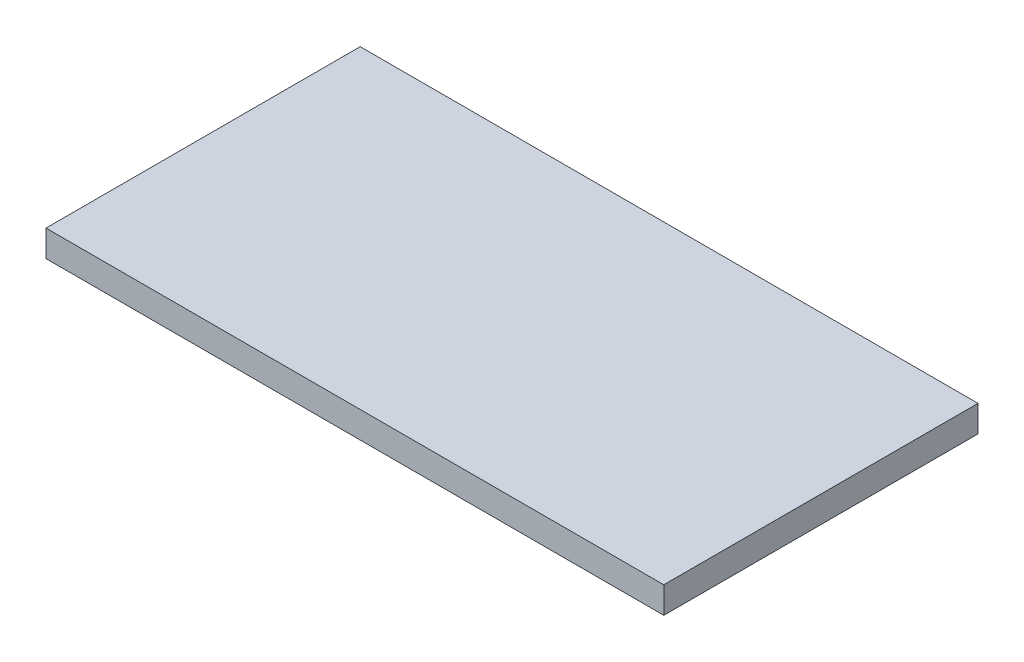
ISO-10303-21;
HEADER;
FILE_DESCRIPTION(('STEP AP214'),'2;1');
FILE_NAME('part.step','',(''),(''),'','','');
FILE_SCHEMA(('AUTOMOTIVE_DESIGN { 1 0 10303 214 1 1 1 1 }'));
ENDSEC;
DATA;
#1=APPLICATION_CONTEXT('core data for automotive mechanical design processes');
#2=APPLICATION_PROTOCOL_DEFINITION('international standard','automotive_design',2000,#1);
#3=PRODUCT_CONTEXT('',#1,'mechanical');
#4=PRODUCT('Part','Part','',(#3));
#5=PRODUCT_RELATED_PRODUCT_CATEGORY('part','',(#4));
#6=PRODUCT_DEFINITION_FORMATION('','',#4);
#7=PRODUCT_DEFINITION_CONTEXT('part definition',#1,'design');
#8=PRODUCT_DEFINITION('design','',#6,#7);
#9=PRODUCT_DEFINITION_SHAPE('','',#8);
#10=(LENGTH_UNIT() NAMED_UNIT(*) SI_UNIT(.MILLI.,.METRE.));
#11=(NAMED_UNIT(*) PLANE_ANGLE_UNIT() SI_UNIT($,.RADIAN.));
#12=(NAMED_UNIT(*) SI_UNIT($,.STERADIAN.) SOLID_ANGLE_UNIT());
#13=UNCERTAINTY_MEASURE_WITH_UNIT(LENGTH_MEASURE(1.E-05),#10,'distance_accuracy_value','');
#14=(GEOMETRIC_REPRESENTATION_CONTEXT(3) GLOBAL_UNCERTAINTY_ASSIGNED_CONTEXT((#13)) GLOBAL_UNIT_ASSIGNED_CONTEXT((#10,
#11,#12)) REPRESENTATION_CONTEXT('',''));
#15=CARTESIAN_POINT('',(0.,0.,0.));
#16=DIRECTION('',(0.,0.,1.));
#17=DIRECTION('',(1.,0.,0.));
#18=AXIS2_PLACEMENT_3D('',#15,#16,#17);
#19=CARTESIAN_POINT('',(0.,3.,0.));
#20=DIRECTION('',(1.,0.,0.));
#21=DIRECTION('',(0.,0.,-1.));
#22=AXIS2_PLACEMENT_3D('',#19,#20,#21);
#23=PLANE('',#22);
#24=DIRECTION('',(0.,0.,1.));
#25=VECTOR('',#24,1.);
#26=CARTESIAN_POINT('',(0.,0.,0.));
#27=LINE('',#26,#25);
#28=CARTESIAN_POINT('',(0.,0.,0.));
#29=VERTEX_POINT('',#28);
#30=CARTESIAN_POINT('',(0.,0.,35.6));
#31=VERTEX_POINT('',#30);
#32=EDGE_CURVE('E98',#29,#31,#27,.T.);
#33=ORIENTED_EDGE('',*,*,#32,.T.);
#34=DIRECTION('',(0.,-1.,0.));
#35=VECTOR('',#34,1.);
#36=CARTESIAN_POINT('',(0.,3.,35.6));
#37=LINE('',#36,#35);
#38=CARTESIAN_POINT('',(0.,3.,35.6));
#39=VERTEX_POINT('',#38);
#40=EDGE_CURVE('E11',#39,#31,#37,.T.);
#41=ORIENTED_EDGE('',*,*,#40,.F.);
#42=DIRECTION('',(0.,0.,1.));
#43=VECTOR('',#42,1.);
#44=CARTESIAN_POINT('',(0.,3.,0.));
#45=LINE('',#44,#43);
#46=CARTESIAN_POINT('',(0.,3.,0.));
#47=VERTEX_POINT('',#46);
#48=EDGE_CURVE('E86',#47,#39,#45,.T.);
#49=ORIENTED_EDGE('',*,*,#48,.F.);
#50=DIRECTION('',(0.,-1.,0.));
#51=VECTOR('',#50,1.);
#52=CARTESIAN_POINT('',(0.,3.,0.));
#53=LINE('',#52,#51);
#54=EDGE_CURVE('E94',#47,#29,#53,.T.);
#55=ORIENTED_EDGE('',*,*,#54,.T.);
#56=EDGE_LOOP('',(#33,#41,#49,#55));
#57=FACE_BOUND('',#56,.T.);
#58=ADVANCED_FACE('F35',(#57),#23,.F.);
#59=CARTESIAN_POINT('',(0.,3.,35.6));
#60=DIRECTION('',(0.,0.,-1.));
#61=DIRECTION('',(-1.,0.,0.));
#62=AXIS2_PLACEMENT_3D('',#59,#60,#61);
#63=PLANE('',#62);
#64=DIRECTION('',(1.,0.,0.));
#65=VECTOR('',#64,1.);
#66=CARTESIAN_POINT('',(0.,0.,35.6));
#67=LINE('',#66,#65);
#68=CARTESIAN_POINT('',(70.,0.,35.6));
#69=VERTEX_POINT('',#68);
#70=EDGE_CURVE('E90',#31,#69,#67,.T.);
#71=ORIENTED_EDGE('',*,*,#70,.T.);
#72=DIRECTION('',(0.,-1.,0.));
#73=VECTOR('',#72,1.);
#74=CARTESIAN_POINT('',(70.,3.,35.6));
#75=LINE('',#74,#73);
#76=CARTESIAN_POINT('',(70.,3.,35.6));
#77=VERTEX_POINT('',#76);
#78=EDGE_CURVE('E43',#77,#69,#75,.T.);
#79=ORIENTED_EDGE('',*,*,#78,.F.);
#80=DIRECTION('',(1.,0.,0.));
#81=VECTOR('',#80,1.);
#82=CARTESIAN_POINT('',(0.,3.,35.6));
#83=LINE('',#82,#81);
#84=EDGE_CURVE('E81',#39,#77,#83,.T.);
#85=ORIENTED_EDGE('',*,*,#84,.F.);
#86=ORIENTED_EDGE('',*,*,#40,.T.);
#87=EDGE_LOOP('',(#71,#79,#85,#86));
#88=FACE_BOUND('',#87,.T.);
#89=ADVANCED_FACE('F89',(#88),#63,.F.);
#90=CARTESIAN_POINT('',(70.,3.,0.));
#91=DIRECTION('',(-1.,0.,0.));
#92=DIRECTION('',(0.,0.,1.));
#93=AXIS2_PLACEMENT_3D('',#90,#91,#92);
#94=PLANE('',#93);
#95=DIRECTION('',(0.,0.,-1.));
#96=VECTOR('',#95,1.);
#97=CARTESIAN_POINT('',(70.,0.,0.));
#98=LINE('',#97,#96);
#99=CARTESIAN_POINT('',(70.,0.,0.));
#100=VERTEX_POINT('',#99);
#101=EDGE_CURVE('E68',#69,#100,#98,.T.);
#102=ORIENTED_EDGE('',*,*,#101,.T.);
#103=DIRECTION('',(0.,-1.,0.));
#104=VECTOR('',#103,1.);
#105=CARTESIAN_POINT('',(70.,3.,0.));
#106=LINE('',#105,#104);
#107=CARTESIAN_POINT('',(70.,3.,0.));
#108=VERTEX_POINT('',#107);
#109=EDGE_CURVE('E91',#108,#100,#106,.T.);
#110=ORIENTED_EDGE('',*,*,#109,.F.);
#111=DIRECTION('',(0.,0.,-1.));
#112=VECTOR('',#111,1.);
#113=CARTESIAN_POINT('',(70.,3.,0.));
#114=LINE('',#113,#112);
#115=EDGE_CURVE('E84',#77,#108,#114,.T.);
#116=ORIENTED_EDGE('',*,*,#115,.F.);
#117=ORIENTED_EDGE('',*,*,#78,.T.);
#118=EDGE_LOOP('',(#102,#110,#116,#117));
#119=FACE_BOUND('',#118,.T.);
#120=ADVANCED_FACE('F92',(#119),#94,.F.);
#121=CARTESIAN_POINT('',(0.,3.,0.));
#122=DIRECTION('',(0.,0.,1.));
#123=DIRECTION('',(1.,0.,0.));
#124=AXIS2_PLACEMENT_3D('',#121,#122,#123);
#125=PLANE('',#124);
#126=DIRECTION('',(-1.,0.,0.));
#127=VECTOR('',#126,1.);
#128=CARTESIAN_POINT('',(0.,0.,0.));
#129=LINE('',#128,#127);
#130=EDGE_CURVE('E74',#100,#29,#129,.T.);
#131=ORIENTED_EDGE('',*,*,#130,.T.);
#132=ORIENTED_EDGE('',*,*,#54,.F.);
#133=DIRECTION('',(-1.,0.,0.));
#134=VECTOR('',#133,1.);
#135=CARTESIAN_POINT('',(0.,3.,0.));
#136=LINE('',#135,#134);
#137=EDGE_CURVE('E51',#108,#47,#136,.T.);
#138=ORIENTED_EDGE('',*,*,#137,.F.);
#139=ORIENTED_EDGE('',*,*,#109,.T.);
#140=EDGE_LOOP('',(#131,#132,#138,#139));
#141=FACE_BOUND('',#140,.T.);
#142=ADVANCED_FACE('F105',(#141),#125,.F.);
#143=CARTESIAN_POINT('',(0.,3.,0.));
#144=DIRECTION('',(0.,1.,0.));
#145=DIRECTION('',(0.,0.,1.));
#146=AXIS2_PLACEMENT_3D('',#143,#144,#145);
#147=PLANE('',#146);
#148=ORIENTED_EDGE('',*,*,#48,.T.);
#149=ORIENTED_EDGE('',*,*,#84,.T.);
#150=ORIENTED_EDGE('',*,*,#115,.T.);
#151=ORIENTED_EDGE('',*,*,#137,.T.);
#152=EDGE_LOOP('',(#148,#149,#150,#151));
#153=FACE_BOUND('',#152,.T.);
#154=ADVANCED_FACE('F82',(#153),#147,.T.);
#155=CARTESIAN_POINT('',(0.,0.,0.));
#156=DIRECTION('',(0.,1.,0.));
#157=DIRECTION('',(0.,0.,1.));
#158=AXIS2_PLACEMENT_3D('',#155,#156,#157);
#159=PLANE('',#158);
#160=ORIENTED_EDGE('',*,*,#32,.F.);
#161=ORIENTED_EDGE('',*,*,#130,.F.);
#162=ORIENTED_EDGE('',*,*,#101,.F.);
#163=ORIENTED_EDGE('',*,*,#70,.F.);
#164=EDGE_LOOP('',(#160,#161,#162,#163));
#165=FACE_BOUND('',#164,.T.);
#166=ADVANCED_FACE('F108',(#165),#159,.F.);
#167=CLOSED_SHELL('',(#58,#89,#120,#142,#154,#166));
#168=MANIFOLD_SOLID_BREP('B2',#167);
#169=ADVANCED_BREP_SHAPE_REPRESENTATION('',(#18,#168),#14);
#170=SHAPE_DEFINITION_REPRESENTATION(#9,#169);
ENDSEC;
END-ISO-10303-21;
